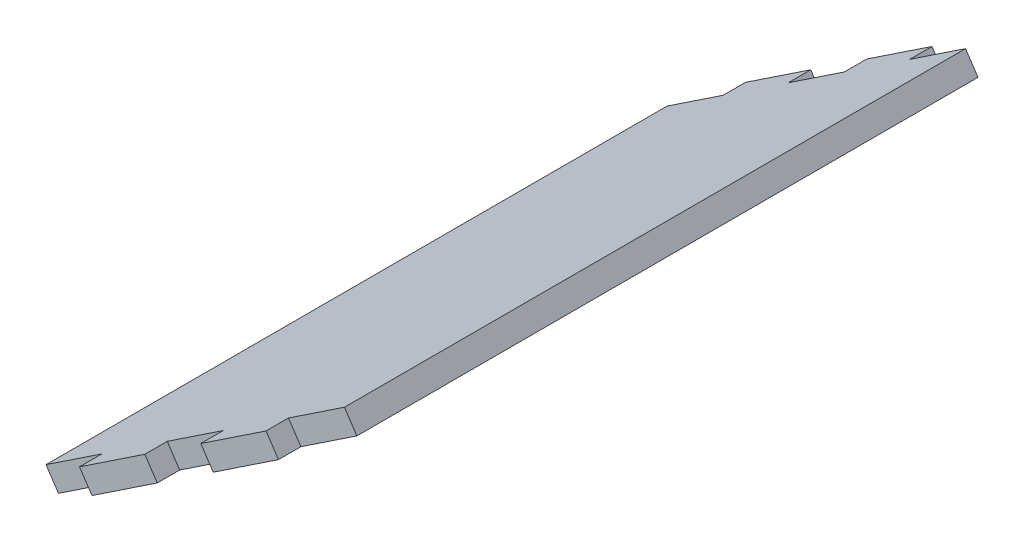
ISO-10303-21;
HEADER;
FILE_DESCRIPTION(('STEP AP214'),'2;1');
FILE_NAME('part.step','',(''),(''),'','','');
FILE_SCHEMA(('AUTOMOTIVE_DESIGN { 1 0 10303 214 1 1 1 1 }'));
ENDSEC;
DATA;
#1=APPLICATION_CONTEXT('core data for automotive mechanical design processes');
#2=APPLICATION_PROTOCOL_DEFINITION('international standard','automotive_design',2000,#1);
#3=PRODUCT_CONTEXT('',#1,'mechanical');
#4=PRODUCT('Part','Part','',(#3));
#5=PRODUCT_RELATED_PRODUCT_CATEGORY('part','',(#4));
#6=PRODUCT_DEFINITION_FORMATION('','',#4);
#7=PRODUCT_DEFINITION_CONTEXT('part definition',#1,'design');
#8=PRODUCT_DEFINITION('design','',#6,#7);
#9=PRODUCT_DEFINITION_SHAPE('','',#8);
#10=(LENGTH_UNIT() NAMED_UNIT(*) SI_UNIT(.MILLI.,.METRE.));
#11=(NAMED_UNIT(*) PLANE_ANGLE_UNIT() SI_UNIT($,.RADIAN.));
#12=(NAMED_UNIT(*) SI_UNIT($,.STERADIAN.) SOLID_ANGLE_UNIT());
#13=UNCERTAINTY_MEASURE_WITH_UNIT(LENGTH_MEASURE(1.E-05),#10,'distance_accuracy_value','');
#14=(GEOMETRIC_REPRESENTATION_CONTEXT(3) GLOBAL_UNCERTAINTY_ASSIGNED_CONTEXT((#13)) GLOBAL_UNIT_ASSIGNED_CONTEXT((#10,
#11,#12)) REPRESENTATION_CONTEXT('',''));
#15=CARTESIAN_POINT('',(0.,0.,0.));
#16=DIRECTION('',(0.,0.,1.));
#17=DIRECTION('',(1.,0.,0.));
#18=AXIS2_PLACEMENT_3D('',#15,#16,#17);
#19=CARTESIAN_POINT('',(0.,0.,0.));
#20=DIRECTION('',(0.,0.,1.));
#21=DIRECTION('',(1.,0.,0.));
#22=AXIS2_PLACEMENT_3D('',#19,#20,#21);
#23=PLANE('',#22);
#24=DIRECTION('',(-0.554700196224776,0.832050294338146,0.));
#25=VECTOR('',#24,1.);
#26=CARTESIAN_POINT('',(-123.081029006185,-82.05401933736,0.));
#27=LINE('',#26,#25);
#28=CARTESIAN_POINT('',(-250.300104449045,108.774593827155,0.));
#29=VERTEX_POINT('',#28);
#30=CARTESIAN_POINT('',(-252.061277572059,111.416353511679,0.));
#31=VERTEX_POINT('',#30);
#32=EDGE_CURVE('E41',#29,#31,#27,.T.);
#33=ORIENTED_EDGE('',*,*,#32,.F.);
#34=DIRECTION('',(0.832050294338146,0.554700196224776,0.));
#35=VECTOR('',#34,1.);
#36=CARTESIAN_POINT('',(-275.396821452019,92.0434491585254,0.));
#37=LINE('',#36,#35);
#38=CARTESIAN_POINT('',(-241.053945553213,114.938699757703,0.));
#39=VERTEX_POINT('',#38);
#40=EDGE_CURVE('E262',#29,#39,#37,.T.);
#41=ORIENTED_EDGE('',*,*,#40,.T.);
#42=DIRECTION('',(0.554700196224776,-0.832050294338146,0.));
#43=VECTOR('',#42,1.);
#44=CARTESIAN_POINT('',(-113.834870110353,-75.8899134068121,0.));
#45=LINE('',#44,#43);
#46=CARTESIAN_POINT('',(-242.815118676226,117.580459442227,0.));
#47=VERTEX_POINT('',#46);
#48=EDGE_CURVE('E312',#47,#39,#45,.T.);
#49=ORIENTED_EDGE('',*,*,#48,.F.);
#50=DIRECTION('',(-0.832050294338146,-0.554700196224776,0.));
#51=VECTOR('',#50,1.);
#52=CARTESIAN_POINT('',(-234.889839622655,122.863978811268,0.));
#53=LINE('',#52,#51);
#54=EDGE_CURVE('E276',#47,#31,#53,.T.);
#55=ORIENTED_EDGE('',*,*,#54,.T.);
#56=EDGE_LOOP('',(#33,#41,#49,#55));
#57=FACE_BOUND('',#56,.T.);
#58=ADVANCED_FACE('F33',(#57),#23,.T.);
#59=CARTESIAN_POINT('',(0.,0.,-94.3225113786736));
#60=DIRECTION('',(0.,0.,1.));
#61=DIRECTION('',(1.,0.,0.));
#62=AXIS2_PLACEMENT_3D('',#59,#60,#61);
#63=PLANE('',#62);
#64=DIRECTION('',(-0.832050294338146,-0.554700196224776,0.));
#65=VECTOR('',#64,1.);
#66=CARTESIAN_POINT('',(-234.889839622655,122.863978811268,-94.3225113786736));
#67=LINE('',#66,#65);
#68=CARTESIAN_POINT('',(-259.98655662563,106.132834142638,-94.3225113786736));
#69=VERTEX_POINT('',#68);
#70=CARTESIAN_POINT('',(-269.232715521462,99.96872821209,-94.3225113786736));
#71=VERTEX_POINT('',#70);
#72=EDGE_CURVE('E266',#69,#71,#67,.T.);
#73=ORIENTED_EDGE('',*,*,#72,.F.);
#74=DIRECTION('',(0.554700196224776,-0.832050294338146,0.));
#75=VECTOR('',#74,1.);
#76=CARTESIAN_POINT('',(-131.006308059756,-87.337538706401,-94.3225113786736));
#77=LINE('',#76,#75);
#78=CARTESIAN_POINT('',(-258.225383502616,103.491074458114,-94.3225113786736));
#79=VERTEX_POINT('',#78);
#80=EDGE_CURVE('E302',#69,#79,#77,.T.);
#81=ORIENTED_EDGE('',*,*,#80,.T.);
#82=DIRECTION('',(0.832050294338146,0.554700196224776,0.));
#83=VECTOR('',#82,1.);
#84=CARTESIAN_POINT('',(-275.396821452019,92.0434491585254,-94.3225113786736));
#85=LINE('',#84,#83);
#86=CARTESIAN_POINT('',(-267.471542398449,97.3269685275664,-94.3225113786736));
#87=VERTEX_POINT('',#86);
#88=EDGE_CURVE('E263',#87,#79,#85,.T.);
#89=ORIENTED_EDGE('',*,*,#88,.F.);
#90=DIRECTION('',(-0.554700196224776,0.832050294338146,0.));
#91=VECTOR('',#90,1.);
#92=CARTESIAN_POINT('',(-140.252466955589,-93.5016446369488,-94.3225113786736));
#93=LINE('',#92,#91);
#94=EDGE_CURVE('E281',#87,#71,#93,.T.);
#95=ORIENTED_EDGE('',*,*,#94,.T.);
#96=EDGE_LOOP('',(#73,#81,#89,#95));
#97=FACE_BOUND('',#96,.T.);
#98=ADVANCED_FACE('F350',(#97),#63,.F.);
#99=CARTESIAN_POINT('',(-277.157994575033,94.685208843049,-94.3225113786736));
#100=DIRECTION('',(-0.832050294338145,-0.554700196224777,0.));
#101=DIRECTION('',(0.554700196224777,-0.832050294338145,0.));
#102=AXIS2_PLACEMENT_3D('',#99,#100,#101);
#103=PLANE('',#102);
#104=DIRECTION('',(-0.554700196224776,0.832050294338146,0.));
#105=VECTOR('',#104,1.);
#106=CARTESIAN_POINT('',(-262.391235312848,72.5350699497445,-3.17500000000125));
#107=LINE('',#106,#105);
#108=CARTESIAN_POINT('',(-275.396821452019,92.0434491585254,-3.17500000000125));
#109=VERTEX_POINT('',#108);
#110=CARTESIAN_POINT('',(-277.157994575033,94.6852088430491,-3.17500000000125));
#111=VERTEX_POINT('',#110);
#112=EDGE_CURVE('E215',#109,#111,#107,.T.);
#113=ORIENTED_EDGE('',*,*,#112,.T.);
#114=DIRECTION('',(0.,0.,1.));
#115=VECTOR('',#114,1.);
#116=CARTESIAN_POINT('',(-277.157994575033,94.685208843049,-94.3225113786736));
#117=LINE('',#116,#115);
#118=CARTESIAN_POINT('',(-277.157994575033,94.6852088430491,-91.1475113786736));
#119=VERTEX_POINT('',#118);
#120=EDGE_CURVE('E278',#119,#111,#117,.T.);
#121=ORIENTED_EDGE('',*,*,#120,.F.);
#122=DIRECTION('',(-0.554700196224776,0.832050294338146,0.));
#123=VECTOR('',#122,1.);
#124=CARTESIAN_POINT('',(-262.391235312848,72.5350699497445,-91.1475113786736));
#125=LINE('',#124,#123);
#126=CARTESIAN_POINT('',(-275.396821452019,92.0434491585254,-91.1475113786736));
#127=VERTEX_POINT('',#126);
#128=EDGE_CURVE('E256',#127,#119,#125,.T.);
#129=ORIENTED_EDGE('',*,*,#128,.F.);
#130=DIRECTION('',(0.,0.,1.));
#131=VECTOR('',#130,1.);
#132=CARTESIAN_POINT('',(-275.396821452019,92.0434491585254,-94.3225113786736));
#133=LINE('',#132,#131);
#134=EDGE_CURVE('E271',#127,#109,#133,.T.);
#135=ORIENTED_EDGE('',*,*,#134,.T.);
#136=EDGE_LOOP('',(#113,#121,#129,#135));
#137=FACE_BOUND('',#136,.T.);
#138=ADVANCED_FACE('F35',(#137),#103,.T.);
#139=CARTESIAN_POINT('',(-234.889839622655,122.863978811268,-94.3225113786736));
#140=DIRECTION('',(-0.554700196224776,0.832050294338146,0.));
#141=DIRECTION('',(-0.832050294338146,-0.554700196224776,0.));
#142=AXIS2_PLACEMENT_3D('',#139,#140,#141);
#143=PLANE('',#142);
#144=DIRECTION('',(0.,0.,-1.));
#145=VECTOR('',#144,1.);
#146=CARTESIAN_POINT('',(-252.061277572059,111.416353511679,0.));
#147=LINE('',#146,#145);
#148=CARTESIAN_POINT('',(-252.061277572059,111.416353511679,-3.17500000000125));
#149=VERTEX_POINT('',#148);
#150=EDGE_CURVE('E182',#31,#149,#147,.T.);
#151=ORIENTED_EDGE('',*,*,#150,.F.);
#152=ORIENTED_EDGE('',*,*,#54,.F.);
#153=DIRECTION('',(0.,0.,1.));
#154=VECTOR('',#153,1.);
#155=CARTESIAN_POINT('',(-242.815118676226,117.580459442227,0.));
#156=LINE('',#155,#154);
#157=CARTESIAN_POINT('',(-242.815118676226,117.580459442227,-3.17500000000125));
#158=VERTEX_POINT('',#157);
#159=EDGE_CURVE('E56',#158,#47,#156,.T.);
#160=ORIENTED_EDGE('',*,*,#159,.F.);
#161=DIRECTION('',(-0.832050294338145,-0.554700196224777,0.));
#162=VECTOR('',#161,1.);
#163=CARTESIAN_POINT('',(-234.889839622655,122.863978811268,-3.17500000000125));
#164=LINE('',#163,#162);
#165=CARTESIAN_POINT('',(-234.889839622655,122.863978811268,-3.17500000000125));
#166=VERTEX_POINT('',#165);
#167=EDGE_CURVE('E199',#166,#158,#164,.T.);
#168=ORIENTED_EDGE('',*,*,#167,.F.);
#169=DIRECTION('',(0.,0.,1.));
#170=VECTOR('',#169,1.);
#171=CARTESIAN_POINT('',(-234.889839622655,122.863978811268,-94.3225113786736));
#172=LINE('',#171,#170);
#173=CARTESIAN_POINT('',(-234.889839622655,122.863978811268,-91.1475113786736));
#174=VERTEX_POINT('',#173);
#175=EDGE_CURVE('E282',#174,#166,#172,.T.);
#176=ORIENTED_EDGE('',*,*,#175,.F.);
#177=DIRECTION('',(0.832050294338145,0.554700196224777,0.));
#178=VECTOR('',#177,1.);
#179=CARTESIAN_POINT('',(-234.889839622655,122.863978811268,-91.1475113786736));
#180=LINE('',#179,#178);
#181=CARTESIAN_POINT('',(-242.815118676226,117.580459442227,-91.1475113786736));
#182=VERTEX_POINT('',#181);
#183=EDGE_CURVE('E240',#182,#174,#180,.T.);
#184=ORIENTED_EDGE('',*,*,#183,.F.);
#185=DIRECTION('',(0.,0.,1.));
#186=VECTOR('',#185,1.);
#187=CARTESIAN_POINT('',(-242.815118676226,117.580459442227,-94.3225113786736));
#188=LINE('',#187,#186);
#189=CARTESIAN_POINT('',(-242.815118676226,117.580459442227,-94.3225113786736));
#190=VERTEX_POINT('',#189);
#191=EDGE_CURVE('E237',#190,#182,#188,.T.);
#192=ORIENTED_EDGE('',*,*,#191,.F.);
#193=CARTESIAN_POINT('',(-252.061277572059,111.416353511679,-94.3225113786736));
#194=VERTEX_POINT('',#193);
#195=EDGE_CURVE('E268',#190,#194,#67,.T.);
#196=ORIENTED_EDGE('',*,*,#195,.T.);
#197=DIRECTION('',(0.,0.,-1.));
#198=VECTOR('',#197,1.);
#199=CARTESIAN_POINT('',(-252.061277572059,111.416353511679,-94.3225113786736));
#200=LINE('',#199,#198);
#201=CARTESIAN_POINT('',(-252.061277572059,111.416353511679,-91.1475113786736));
#202=VERTEX_POINT('',#201);
#203=EDGE_CURVE('E227',#202,#194,#200,.T.);
#204=ORIENTED_EDGE('',*,*,#203,.F.);
#205=DIRECTION('',(0.832050294338147,0.554700196224774,0.));
#206=VECTOR('',#205,1.);
#207=CARTESIAN_POINT('',(-259.98655662563,106.132834142638,-91.1475113786736));
#208=LINE('',#207,#206);
#209=CARTESIAN_POINT('',(-259.98655662563,106.132834142638,-91.1475113786736));
#210=VERTEX_POINT('',#209);
#211=EDGE_CURVE('E224',#210,#202,#208,.T.);
#212=ORIENTED_EDGE('',*,*,#211,.F.);
#213=DIRECTION('',(0.,0.,1.));
#214=VECTOR('',#213,1.);
#215=CARTESIAN_POINT('',(-259.98655662563,106.132834142638,-94.3225113786736));
#216=LINE('',#215,#214);
#217=EDGE_CURVE('E221',#69,#210,#216,.T.);
#218=ORIENTED_EDGE('',*,*,#217,.F.);
#219=ORIENTED_EDGE('',*,*,#72,.T.);
#220=DIRECTION('',(0.,0.,-1.));
#221=VECTOR('',#220,1.);
#222=CARTESIAN_POINT('',(-269.232715521462,99.9687282120901,-94.3225113786736));
#223=LINE('',#222,#221);
#224=CARTESIAN_POINT('',(-269.232715521462,99.9687282120901,-91.1475113786736));
#225=VERTEX_POINT('',#224);
#226=EDGE_CURVE('E253',#225,#71,#223,.T.);
#227=ORIENTED_EDGE('',*,*,#226,.F.);
#228=DIRECTION('',(0.832050294338144,0.554700196224778,0.));
#229=VECTOR('',#228,1.);
#230=CARTESIAN_POINT('',(-277.157994575033,94.6852088430491,-91.1475113786736));
#231=LINE('',#230,#229);
#232=EDGE_CURVE('E250',#119,#225,#231,.T.);
#233=ORIENTED_EDGE('',*,*,#232,.F.);
#234=ORIENTED_EDGE('',*,*,#120,.T.);
#235=DIRECTION('',(-0.832050294338144,-0.554700196224778,0.));
#236=VECTOR('',#235,1.);
#237=CARTESIAN_POINT('',(-277.157994575033,94.6852088430491,-3.17500000000125));
#238=LINE('',#237,#236);
#239=CARTESIAN_POINT('',(-269.232715521462,99.9687282120901,-3.17500000000125));
#240=VERTEX_POINT('',#239);
#241=EDGE_CURVE('E212',#240,#111,#238,.T.);
#242=ORIENTED_EDGE('',*,*,#241,.F.);
#243=DIRECTION('',(0.,0.,-1.));
#244=VECTOR('',#243,1.);
#245=CARTESIAN_POINT('',(-269.232715521462,99.9687282120901,0.));
#246=LINE('',#245,#244);
#247=CARTESIAN_POINT('',(-269.232715521462,99.9687282120901,0.));
#248=VERTEX_POINT('',#247);
#249=EDGE_CURVE('E209',#248,#240,#246,.T.);
#250=ORIENTED_EDGE('',*,*,#249,.F.);
#251=CARTESIAN_POINT('',(-259.98655662563,106.132834142638,0.));
#252=VERTEX_POINT('',#251);
#253=EDGE_CURVE('E275',#252,#248,#53,.T.);
#254=ORIENTED_EDGE('',*,*,#253,.F.);
#255=DIRECTION('',(0.,0.,1.));
#256=VECTOR('',#255,1.);
#257=CARTESIAN_POINT('',(-259.98655662563,106.132834142638,0.));
#258=LINE('',#257,#256);
#259=CARTESIAN_POINT('',(-259.98655662563,106.132834142638,-3.17500000000125));
#260=VERTEX_POINT('',#259);
#261=EDGE_CURVE('E48',#260,#252,#258,.T.);
#262=ORIENTED_EDGE('',*,*,#261,.F.);
#263=DIRECTION('',(-0.832050294338147,-0.554700196224774,0.));
#264=VECTOR('',#263,1.);
#265=CARTESIAN_POINT('',(-252.061277572059,111.416353511679,-3.17500000000125));
#266=LINE('',#265,#264);
#267=EDGE_CURVE('E175',#149,#260,#266,.T.);
#268=ORIENTED_EDGE('',*,*,#267,.F.);
#269=EDGE_LOOP('',(#151,#152,#160,#168,#176,#184,#192,#196,#204,#212,#218,#219,#227,#233,#234,
#242,#250,#254,#262,#268));
#270=FACE_BOUND('',#269,.T.);
#271=ADVANCED_FACE('F189',(#270),#143,.T.);
#272=CARTESIAN_POINT('',(-233.128666499642,120.222219126744,-94.3225113786736));
#273=DIRECTION('',(0.832050294338146,0.554700196224775,0.));
#274=DIRECTION('',(-0.554700196224775,0.832050294338146,0.));
#275=AXIS2_PLACEMENT_3D('',#272,#273,#274);
#276=PLANE('',#275);
#277=DIRECTION('',(-0.554700196224776,0.832050294338146,0.));
#278=VECTOR('',#277,1.);
#279=CARTESIAN_POINT('',(-220.12308036047,100.713839917963,-3.17500000000125));
#280=LINE('',#279,#278);
#281=CARTESIAN_POINT('',(-233.128666499642,120.222219126744,-3.17500000000125));
#282=VERTEX_POINT('',#281);
#283=EDGE_CURVE('E203',#282,#166,#280,.T.);
#284=ORIENTED_EDGE('',*,*,#283,.F.);
#285=DIRECTION('',(0.,0.,1.));
#286=VECTOR('',#285,1.);
#287=CARTESIAN_POINT('',(-233.128666499642,120.222219126744,-94.3225113786736));
#288=LINE('',#287,#286);
#289=CARTESIAN_POINT('',(-233.128666499642,120.222219126744,-91.1475113786736));
#290=VERTEX_POINT('',#289);
#291=EDGE_CURVE('E285',#290,#282,#288,.T.);
#292=ORIENTED_EDGE('',*,*,#291,.F.);
#293=DIRECTION('',(-0.554700196224776,0.832050294338146,0.));
#294=VECTOR('',#293,1.);
#295=CARTESIAN_POINT('',(-220.12308036047,100.713839917963,-91.1475113786736));
#296=LINE('',#295,#294);
#297=EDGE_CURVE('E243',#290,#174,#296,.T.);
#298=ORIENTED_EDGE('',*,*,#297,.T.);
#299=ORIENTED_EDGE('',*,*,#175,.T.);
#300=EDGE_LOOP('',(#284,#292,#298,#299));
#301=FACE_BOUND('',#300,.T.);
#302=ADVANCED_FACE('F383',(#301),#276,.T.);
#303=CARTESIAN_POINT('',(-275.396821452019,92.0434491585254,-94.3225113786736));
#304=DIRECTION('',(0.554700196224776,-0.832050294338146,0.));
#305=DIRECTION('',(0.832050294338146,0.554700196224776,0.));
#306=AXIS2_PLACEMENT_3D('',#303,#304,#305);
#307=PLANE('',#306);
#308=DIRECTION('',(0.,0.,1.));
#309=VECTOR('',#308,1.);
#310=CARTESIAN_POINT('',(-250.300104449045,108.774593827155,-94.3225113786736));
#311=LINE('',#310,#309);
#312=CARTESIAN_POINT('',(-250.300104449045,108.774593827155,-3.17500000000125));
#313=VERTEX_POINT('',#312);
#314=EDGE_CURVE('E197',#313,#29,#311,.T.);
#315=ORIENTED_EDGE('',*,*,#314,.F.);
#316=DIRECTION('',(0.832050294338146,0.554700196224776,0.));
#317=VECTOR('',#316,1.);
#318=CARTESIAN_POINT('',(-275.396821452019,92.0434491585254,-3.17500000000125));
#319=LINE('',#318,#317);
#320=CARTESIAN_POINT('',(-258.225383502616,103.491074458114,-3.17500000000125));
#321=VERTEX_POINT('',#320);
#322=EDGE_CURVE('E11',#321,#313,#319,.T.);
#323=ORIENTED_EDGE('',*,*,#322,.F.);
#324=DIRECTION('',(0.,0.,-1.));
#325=VECTOR('',#324,1.);
#326=CARTESIAN_POINT('',(-258.225383502616,103.491074458114,-94.3225113786736));
#327=LINE('',#326,#325);
#328=CARTESIAN_POINT('',(-258.225383502616,103.491074458114,0.));
#329=VERTEX_POINT('',#328);
#330=EDGE_CURVE('E194',#329,#321,#327,.T.);
#331=ORIENTED_EDGE('',*,*,#330,.F.);
#332=CARTESIAN_POINT('',(-267.471542398449,97.3269685275664,0.));
#333=VERTEX_POINT('',#332);
#334=EDGE_CURVE('E272',#333,#329,#37,.T.);
#335=ORIENTED_EDGE('',*,*,#334,.F.);
#336=DIRECTION('',(0.,0.,1.));
#337=VECTOR('',#336,1.);
#338=CARTESIAN_POINT('',(-267.471542398449,97.3269685275664,-94.3225113786736));
#339=LINE('',#338,#337);
#340=CARTESIAN_POINT('',(-267.471542398449,97.3269685275664,-3.17500000000125));
#341=VERTEX_POINT('',#340);
#342=EDGE_CURVE('E218',#341,#333,#339,.T.);
#343=ORIENTED_EDGE('',*,*,#342,.F.);
#344=DIRECTION('',(0.832050294338146,0.554700196224776,0.));
#345=VECTOR('',#344,1.);
#346=CARTESIAN_POINT('',(-275.396821452019,92.0434491585254,-3.17500000000125));
#347=LINE('',#346,#345);
#348=EDGE_CURVE('E310',#109,#341,#347,.T.);
#349=ORIENTED_EDGE('',*,*,#348,.F.);
#350=ORIENTED_EDGE('',*,*,#134,.F.);
#351=DIRECTION('',(-0.832050294338146,-0.554700196224776,0.));
#352=VECTOR('',#351,1.);
#353=CARTESIAN_POINT('',(-275.396821452019,92.0434491585254,-91.1475113786736));
#354=LINE('',#353,#352);
#355=CARTESIAN_POINT('',(-267.471542398449,97.3269685275664,-91.1475113786736));
#356=VERTEX_POINT('',#355);
#357=EDGE_CURVE('E292',#356,#127,#354,.T.);
#358=ORIENTED_EDGE('',*,*,#357,.F.);
#359=DIRECTION('',(0.,0.,1.));
#360=VECTOR('',#359,1.);
#361=CARTESIAN_POINT('',(-267.471542398449,97.3269685275664,-94.3225113786736));
#362=LINE('',#361,#360);
#363=EDGE_CURVE('E259',#87,#356,#362,.T.);
#364=ORIENTED_EDGE('',*,*,#363,.F.);
#365=ORIENTED_EDGE('',*,*,#88,.T.);
#366=DIRECTION('',(0.,0.,-1.));
#367=VECTOR('',#366,1.);
#368=CARTESIAN_POINT('',(-258.225383502616,103.491074458114,-94.3225113786736));
#369=LINE('',#368,#367);
#370=CARTESIAN_POINT('',(-258.225383502616,103.491074458114,-91.1475113786736));
#371=VERTEX_POINT('',#370);
#372=EDGE_CURVE('E235',#371,#79,#369,.T.);
#373=ORIENTED_EDGE('',*,*,#372,.F.);
#374=DIRECTION('',(-0.832050294338146,-0.554700196224776,0.));
#375=VECTOR('',#374,1.);
#376=CARTESIAN_POINT('',(-275.396821452019,92.0434491585254,-91.1475113786736));
#377=LINE('',#376,#375);
#378=CARTESIAN_POINT('',(-250.300104449045,108.774593827155,-91.1475113786736));
#379=VERTEX_POINT('',#378);
#380=EDGE_CURVE('E305',#379,#371,#377,.T.);
#381=ORIENTED_EDGE('',*,*,#380,.F.);
#382=DIRECTION('',(0.,0.,1.));
#383=VECTOR('',#382,1.);
#384=CARTESIAN_POINT('',(-250.300104449045,108.774593827155,-94.3225113786736));
#385=LINE('',#384,#383);
#386=CARTESIAN_POINT('',(-250.300104449045,108.774593827155,-94.3225113786736));
#387=VERTEX_POINT('',#386);
#388=EDGE_CURVE('E232',#387,#379,#385,.T.);
#389=ORIENTED_EDGE('',*,*,#388,.F.);
#390=CARTESIAN_POINT('',(-241.053945553213,114.938699757703,-94.3225113786736));
#391=VERTEX_POINT('',#390);
#392=EDGE_CURVE('E267',#387,#391,#85,.T.);
#393=ORIENTED_EDGE('',*,*,#392,.T.);
#394=DIRECTION('',(0.,0.,-1.));
#395=VECTOR('',#394,1.);
#396=CARTESIAN_POINT('',(-241.053945553213,114.938699757703,-94.3225113786736));
#397=LINE('',#396,#395);
#398=CARTESIAN_POINT('',(-241.053945553213,114.938699757703,-91.1475113786736));
#399=VERTEX_POINT('',#398);
#400=EDGE_CURVE('E246',#399,#391,#397,.T.);
#401=ORIENTED_EDGE('',*,*,#400,.F.);
#402=DIRECTION('',(-0.832050294338146,-0.554700196224776,0.));
#403=VECTOR('',#402,1.);
#404=CARTESIAN_POINT('',(-275.396821452019,92.0434491585254,-91.1475113786736));
#405=LINE('',#404,#403);
#406=EDGE_CURVE('E297',#290,#399,#405,.T.);
#407=ORIENTED_EDGE('',*,*,#406,.F.);
#408=ORIENTED_EDGE('',*,*,#291,.T.);
#409=DIRECTION('',(0.832050294338146,0.554700196224776,0.));
#410=VECTOR('',#409,1.);
#411=CARTESIAN_POINT('',(-275.396821452019,92.0434491585254,-3.17500000000125));
#412=LINE('',#411,#410);
#413=CARTESIAN_POINT('',(-241.053945553213,114.938699757703,-3.17500000000125));
#414=VERTEX_POINT('',#413);
#415=EDGE_CURVE('E314',#414,#282,#412,.T.);
#416=ORIENTED_EDGE('',*,*,#415,.F.);
#417=DIRECTION('',(0.,0.,-1.));
#418=VECTOR('',#417,1.);
#419=CARTESIAN_POINT('',(-241.053945553213,114.938699757703,-94.3225113786736));
#420=LINE('',#419,#418);
#421=EDGE_CURVE('E206',#39,#414,#420,.T.);
#422=ORIENTED_EDGE('',*,*,#421,.F.);
#423=ORIENTED_EDGE('',*,*,#40,.F.);
#424=EDGE_LOOP('',(#315,#323,#331,#335,#343,#349,#350,#358,#364,#365,#373,#381,#389,#393,#401,
#407,#408,#416,#422,#423));
#425=FACE_BOUND('',#424,.T.);
#426=ADVANCED_FACE('F322',(#425),#307,.T.);
#427=ORIENTED_EDGE('',*,*,#392,.F.);
#428=DIRECTION('',(-0.554700196224776,0.832050294338146,0.));
#429=VECTOR('',#428,1.);
#430=CARTESIAN_POINT('',(-123.081029006185,-82.0540193373599,-94.3225113786736));
#431=LINE('',#430,#429);
#432=EDGE_CURVE('E299',#387,#194,#431,.T.);
#433=ORIENTED_EDGE('',*,*,#432,.T.);
#434=ORIENTED_EDGE('',*,*,#195,.F.);
#435=DIRECTION('',(0.554700196224776,-0.832050294338146,0.));
#436=VECTOR('',#435,1.);
#437=CARTESIAN_POINT('',(-113.834870110353,-75.8899134068121,-94.3225113786736));
#438=LINE('',#437,#436);
#439=EDGE_CURVE('E294',#190,#391,#438,.T.);
#440=ORIENTED_EDGE('',*,*,#439,.T.);
#441=EDGE_LOOP('',(#427,#433,#434,#440));
#442=FACE_BOUND('',#441,.T.);
#443=ADVANCED_FACE('F368',(#442),#63,.F.);
#444=DIRECTION('',(0.554700196224776,-0.832050294338146,0.));
#445=VECTOR('',#444,1.);
#446=CARTESIAN_POINT('',(-131.006308059756,-87.337538706401,0.));
#447=LINE('',#446,#445);
#448=EDGE_CURVE('E316',#252,#329,#447,.T.);
#449=ORIENTED_EDGE('',*,*,#448,.F.);
#450=ORIENTED_EDGE('',*,*,#253,.T.);
#451=DIRECTION('',(-0.554700196224776,0.832050294338146,0.));
#452=VECTOR('',#451,1.);
#453=CARTESIAN_POINT('',(-140.252466955589,-93.5016446369488,0.));
#454=LINE('',#453,#452);
#455=EDGE_CURVE('E307',#333,#248,#454,.T.);
#456=ORIENTED_EDGE('',*,*,#455,.F.);
#457=ORIENTED_EDGE('',*,*,#334,.T.);
#458=EDGE_LOOP('',(#449,#450,#456,#457));
#459=FACE_BOUND('',#458,.T.);
#460=ADVANCED_FACE('F325',(#459),#23,.T.);
#461=CARTESIAN_POINT('',(-254.465956259277,77.8185893187855,-94.3225113786736));
#462=DIRECTION('',(0.832050294338146,0.554700196224776,0.));
#463=DIRECTION('',(-0.554700196224776,0.832050294338146,0.));
#464=AXIS2_PLACEMENT_3D('',#461,#462,#463);
#465=PLANE('',#464);
#466=ORIENTED_EDGE('',*,*,#363,.T.);
#467=DIRECTION('',(-0.554700196224776,0.832050294338146,0.));
#468=VECTOR('',#467,1.);
#469=CARTESIAN_POINT('',(-254.465956259277,77.8185893187855,-91.1475113786736));
#470=LINE('',#469,#468);
#471=EDGE_CURVE('E257',#356,#225,#470,.T.);
#472=ORIENTED_EDGE('',*,*,#471,.T.);
#473=ORIENTED_EDGE('',*,*,#226,.T.);
#474=ORIENTED_EDGE('',*,*,#94,.F.);
#475=EDGE_LOOP('',(#466,#472,#473,#474));
#476=FACE_BOUND('',#475,.T.);
#477=ADVANCED_FACE('F347',(#476),#465,.F.);
#478=CARTESIAN_POINT('',(-262.391235312848,72.5350699497445,-91.1475113786736));
#479=DIRECTION('',(0.,0.,1.));
#480=DIRECTION('',(1.,0.,0.));
#481=AXIS2_PLACEMENT_3D('',#478,#479,#480);
#482=PLANE('',#481);
#483=ORIENTED_EDGE('',*,*,#357,.T.);
#484=ORIENTED_EDGE('',*,*,#128,.T.);
#485=ORIENTED_EDGE('',*,*,#232,.T.);
#486=ORIENTED_EDGE('',*,*,#471,.F.);
#487=EDGE_LOOP('',(#483,#484,#485,#486));
#488=FACE_BOUND('',#487,.T.);
#489=ADVANCED_FACE('F344',(#488),#482,.F.);
#490=CARTESIAN_POINT('',(-220.12308036047,100.713839917963,-91.1475113786736));
#491=DIRECTION('',(0.,0.,1.));
#492=DIRECTION('',(1.,0.,0.));
#493=AXIS2_PLACEMENT_3D('',#490,#491,#492);
#494=PLANE('',#493);
#495=ORIENTED_EDGE('',*,*,#406,.T.);
#496=DIRECTION('',(-0.554700196224776,0.832050294338146,0.));
#497=VECTOR('',#496,1.);
#498=CARTESIAN_POINT('',(-228.048359414041,95.4303205489221,-91.1475113786736));
#499=LINE('',#498,#497);
#500=EDGE_CURVE('E242',#399,#182,#499,.T.);
#501=ORIENTED_EDGE('',*,*,#500,.T.);
#502=ORIENTED_EDGE('',*,*,#183,.T.);
#503=ORIENTED_EDGE('',*,*,#297,.F.);
#504=EDGE_LOOP('',(#495,#501,#502,#503));
#505=FACE_BOUND('',#504,.T.);
#506=ADVANCED_FACE('F378',(#505),#494,.F.);
#507=CARTESIAN_POINT('',(-228.048359414041,95.4303205489221,-94.3225113786736));
#508=DIRECTION('',(-0.832050294338146,-0.554700196224776,0.));
#509=DIRECTION('',(0.554700196224776,-0.832050294338146,0.));
#510=AXIS2_PLACEMENT_3D('',#507,#508,#509);
#511=PLANE('',#510);
#512=ORIENTED_EDGE('',*,*,#400,.T.);
#513=ORIENTED_EDGE('',*,*,#439,.F.);
#514=ORIENTED_EDGE('',*,*,#191,.T.);
#515=ORIENTED_EDGE('',*,*,#500,.F.);
#516=EDGE_LOOP('',(#512,#513,#514,#515));
#517=FACE_BOUND('',#516,.T.);
#518=ADVANCED_FACE('F372',(#517),#511,.F.);
#519=CARTESIAN_POINT('',(-245.219797363444,83.9826952493333,-94.3225113786736));
#520=DIRECTION('',(-0.832050294338146,-0.554700196224776,0.));
#521=DIRECTION('',(0.554700196224776,-0.832050294338146,0.));
#522=AXIS2_PLACEMENT_3D('',#519,#520,#521);
#523=PLANE('',#522);
#524=ORIENTED_EDGE('',*,*,#372,.T.);
#525=ORIENTED_EDGE('',*,*,#80,.F.);
#526=ORIENTED_EDGE('',*,*,#217,.T.);
#527=DIRECTION('',(-0.554700196224776,0.832050294338146,0.));
#528=VECTOR('',#527,1.);
#529=CARTESIAN_POINT('',(-245.219797363444,83.9826952493333,-91.1475113786736));
#530=LINE('',#529,#528);
#531=EDGE_CURVE('E229',#371,#210,#530,.T.);
#532=ORIENTED_EDGE('',*,*,#531,.F.);
#533=EDGE_LOOP('',(#524,#525,#526,#532));
#534=FACE_BOUND('',#533,.T.);
#535=ADVANCED_FACE('F356',(#534),#523,.F.);
#536=CARTESIAN_POINT('',(-237.294518309873,89.2662146183743,-94.3225113786736));
#537=DIRECTION('',(0.832050294338146,0.554700196224776,0.));
#538=DIRECTION('',(-0.554700196224776,0.832050294338146,0.));
#539=AXIS2_PLACEMENT_3D('',#536,#537,#538);
#540=PLANE('',#539);
#541=ORIENTED_EDGE('',*,*,#388,.T.);
#542=DIRECTION('',(-0.554700196224776,0.832050294338146,0.));
#543=VECTOR('',#542,1.);
#544=CARTESIAN_POINT('',(-237.294518309873,89.2662146183743,-91.1475113786736));
#545=LINE('',#544,#543);
#546=EDGE_CURVE('E230',#379,#202,#545,.T.);
#547=ORIENTED_EDGE('',*,*,#546,.T.);
#548=ORIENTED_EDGE('',*,*,#203,.T.);
#549=ORIENTED_EDGE('',*,*,#432,.F.);
#550=EDGE_LOOP('',(#541,#547,#548,#549));
#551=FACE_BOUND('',#550,.T.);
#552=ADVANCED_FACE('F364',(#551),#540,.F.);
#553=CARTESIAN_POINT('',(-245.219797363444,83.9826952493333,-91.1475113786736));
#554=DIRECTION('',(0.,0.,1.));
#555=DIRECTION('',(1.,0.,0.));
#556=AXIS2_PLACEMENT_3D('',#553,#554,#555);
#557=PLANE('',#556);
#558=ORIENTED_EDGE('',*,*,#380,.T.);
#559=ORIENTED_EDGE('',*,*,#531,.T.);
#560=ORIENTED_EDGE('',*,*,#211,.T.);
#561=ORIENTED_EDGE('',*,*,#546,.F.);
#562=EDGE_LOOP('',(#558,#559,#560,#561));
#563=FACE_BOUND('',#562,.T.);
#564=ADVANCED_FACE('F360',(#563),#557,.F.);
#565=CARTESIAN_POINT('',(-262.391235312848,72.5350699497445,-3.17500000000125));
#566=DIRECTION('',(0.,0.,-1.));
#567=DIRECTION('',(-1.,0.,0.));
#568=AXIS2_PLACEMENT_3D('',#565,#566,#567);
#569=PLANE('',#568);
#570=ORIENTED_EDGE('',*,*,#348,.T.);
#571=DIRECTION('',(-0.554700196224776,0.832050294338146,0.));
#572=VECTOR('',#571,1.);
#573=CARTESIAN_POINT('',(-254.465956259277,77.8185893187855,-3.17500000000125));
#574=LINE('',#573,#572);
#575=EDGE_CURVE('E214',#341,#240,#574,.T.);
#576=ORIENTED_EDGE('',*,*,#575,.T.);
#577=ORIENTED_EDGE('',*,*,#241,.T.);
#578=ORIENTED_EDGE('',*,*,#112,.F.);
#579=EDGE_LOOP('',(#570,#576,#577,#578));
#580=FACE_BOUND('',#579,.T.);
#581=ADVANCED_FACE('F334',(#580),#569,.F.);
#582=CARTESIAN_POINT('',(-254.465956259277,77.8185893187855,0.));
#583=DIRECTION('',(0.832050294338146,0.554700196224776,0.));
#584=DIRECTION('',(-0.554700196224776,0.832050294338146,0.));
#585=AXIS2_PLACEMENT_3D('',#582,#583,#584);
#586=PLANE('',#585);
#587=ORIENTED_EDGE('',*,*,#342,.T.);
#588=ORIENTED_EDGE('',*,*,#455,.T.);
#589=ORIENTED_EDGE('',*,*,#249,.T.);
#590=ORIENTED_EDGE('',*,*,#575,.F.);
#591=EDGE_LOOP('',(#587,#588,#589,#590));
#592=FACE_BOUND('',#591,.T.);
#593=ADVANCED_FACE('F328',(#592),#586,.F.);
#594=CARTESIAN_POINT('',(-228.048359414041,95.4303205489221,0.));
#595=DIRECTION('',(-0.832050294338146,-0.554700196224776,0.));
#596=DIRECTION('',(0.554700196224776,-0.832050294338146,0.));
#597=AXIS2_PLACEMENT_3D('',#594,#595,#596);
#598=PLANE('',#597);
#599=ORIENTED_EDGE('',*,*,#421,.T.);
#600=DIRECTION('',(-0.554700196224776,0.832050294338146,0.));
#601=VECTOR('',#600,1.);
#602=CARTESIAN_POINT('',(-228.048359414041,95.4303205489221,-3.17500000000125));
#603=LINE('',#602,#601);
#604=EDGE_CURVE('E204',#414,#158,#603,.T.);
#605=ORIENTED_EDGE('',*,*,#604,.T.);
#606=ORIENTED_EDGE('',*,*,#159,.T.);
#607=ORIENTED_EDGE('',*,*,#48,.T.);
#608=EDGE_LOOP('',(#599,#605,#606,#607));
#609=FACE_BOUND('',#608,.T.);
#610=ADVANCED_FACE('F390',(#609),#598,.F.);
#611=CARTESIAN_POINT('',(-220.12308036047,100.713839917963,-3.17500000000125));
#612=DIRECTION('',(0.,0.,-1.));
#613=DIRECTION('',(-1.,0.,0.));
#614=AXIS2_PLACEMENT_3D('',#611,#612,#613);
#615=PLANE('',#614);
#616=ORIENTED_EDGE('',*,*,#415,.T.);
#617=ORIENTED_EDGE('',*,*,#283,.T.);
#618=ORIENTED_EDGE('',*,*,#167,.T.);
#619=ORIENTED_EDGE('',*,*,#604,.F.);
#620=EDGE_LOOP('',(#616,#617,#618,#619));
#621=FACE_BOUND('',#620,.T.);
#622=ADVANCED_FACE('F389',(#621),#615,.F.);
#623=CARTESIAN_POINT('',(-237.294518309873,89.2662146183743,0.));
#624=DIRECTION('',(0.832050294338146,0.554700196224776,0.));
#625=DIRECTION('',(-0.554700196224776,0.832050294338146,0.));
#626=AXIS2_PLACEMENT_3D('',#623,#624,#625);
#627=PLANE('',#626);
#628=ORIENTED_EDGE('',*,*,#314,.T.);
#629=ORIENTED_EDGE('',*,*,#32,.T.);
#630=ORIENTED_EDGE('',*,*,#150,.T.);
#631=DIRECTION('',(-0.554700196224776,0.832050294338146,0.));
#632=VECTOR('',#631,1.);
#633=CARTESIAN_POINT('',(-237.294518309873,89.2662146183743,-3.17500000000125));
#634=LINE('',#633,#632);
#635=EDGE_CURVE('E170',#313,#149,#634,.T.);
#636=ORIENTED_EDGE('',*,*,#635,.F.);
#637=EDGE_LOOP('',(#628,#629,#630,#636));
#638=FACE_BOUND('',#637,.T.);
#639=ADVANCED_FACE('F183',(#638),#627,.F.);
#640=CARTESIAN_POINT('',(-245.219797363444,83.9826952493333,0.));
#641=DIRECTION('',(-0.832050294338146,-0.554700196224776,0.));
#642=DIRECTION('',(0.554700196224776,-0.832050294338146,0.));
#643=AXIS2_PLACEMENT_3D('',#640,#641,#642);
#644=PLANE('',#643);
#645=ORIENTED_EDGE('',*,*,#330,.T.);
#646=DIRECTION('',(-0.554700196224776,0.832050294338146,0.));
#647=VECTOR('',#646,1.);
#648=CARTESIAN_POINT('',(-245.219797363444,83.9826952493333,-3.17500000000125));
#649=LINE('',#648,#647);
#650=EDGE_CURVE('E179',#321,#260,#649,.T.);
#651=ORIENTED_EDGE('',*,*,#650,.T.);
#652=ORIENTED_EDGE('',*,*,#261,.T.);
#653=ORIENTED_EDGE('',*,*,#448,.T.);
#654=EDGE_LOOP('',(#645,#651,#652,#653));
#655=FACE_BOUND('',#654,.T.);
#656=ADVANCED_FACE('F318',(#655),#644,.F.);
#657=CARTESIAN_POINT('',(-237.294518309873,89.2662146183743,-3.17500000000125));
#658=DIRECTION('',(0.,0.,-1.));
#659=DIRECTION('',(-1.,0.,0.));
#660=AXIS2_PLACEMENT_3D('',#657,#658,#659);
#661=PLANE('',#660);
#662=ORIENTED_EDGE('',*,*,#322,.T.);
#663=ORIENTED_EDGE('',*,*,#635,.T.);
#664=ORIENTED_EDGE('',*,*,#267,.T.);
#665=ORIENTED_EDGE('',*,*,#650,.F.);
#666=EDGE_LOOP('',(#662,#663,#664,#665));
#667=FACE_BOUND('',#666,.T.);
#668=ADVANCED_FACE('F172',(#667),#661,.F.);
#669=CLOSED_SHELL('',(#58,#98,#138,#271,#302,#426,#443,#460,#477,#489,#506,#518,#535,#552,#564,
#581,#593,#610,#622,#639,#656,#668));
#670=MANIFOLD_SOLID_BREP('B2',#669);
#671=ADVANCED_BREP_SHAPE_REPRESENTATION('',(#18,#670),#14);
#672=SHAPE_DEFINITION_REPRESENTATION(#9,#671);
ENDSEC;
END-ISO-10303-21;
